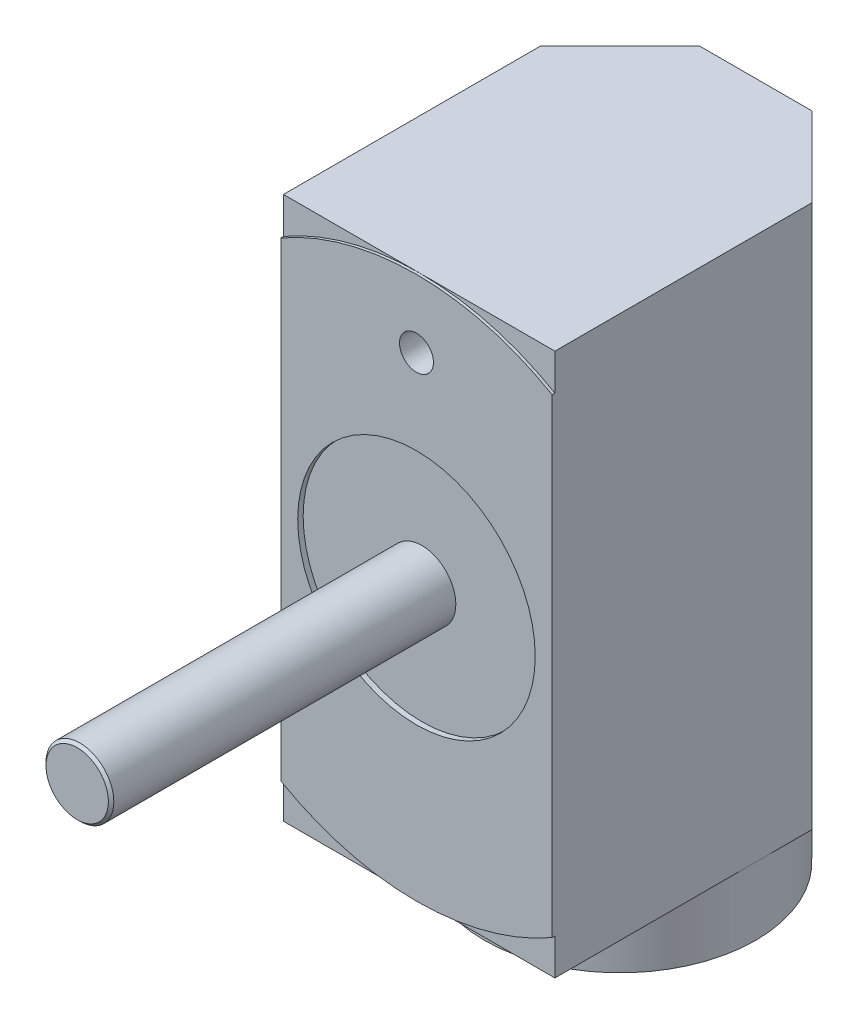
ISO-10303-21;
HEADER;
FILE_DESCRIPTION(('STEP AP214'),'2;1');
FILE_NAME('part.step','',(''),(''),'','','');
FILE_SCHEMA(('AUTOMOTIVE_DESIGN { 1 0 10303 214 1 1 1 1 }'));
ENDSEC;
DATA;
#1=APPLICATION_CONTEXT('core data for automotive mechanical design processes');
#2=APPLICATION_PROTOCOL_DEFINITION('international standard','automotive_design',2000,#1);
#3=PRODUCT_CONTEXT('',#1,'mechanical');
#4=PRODUCT('Part','Part','',(#3));
#5=PRODUCT_RELATED_PRODUCT_CATEGORY('part','',(#4));
#6=PRODUCT_DEFINITION_FORMATION('','',#4);
#7=PRODUCT_DEFINITION_CONTEXT('part definition',#1,'design');
#8=PRODUCT_DEFINITION('design','',#6,#7);
#9=PRODUCT_DEFINITION_SHAPE('','',#8);
#10=(LENGTH_UNIT() NAMED_UNIT(*) SI_UNIT(.MILLI.,.METRE.));
#11=(NAMED_UNIT(*) PLANE_ANGLE_UNIT() SI_UNIT($,.RADIAN.));
#12=(NAMED_UNIT(*) SI_UNIT($,.STERADIAN.) SOLID_ANGLE_UNIT());
#13=UNCERTAINTY_MEASURE_WITH_UNIT(LENGTH_MEASURE(1.E-05),#10,'distance_accuracy_value','');
#14=(GEOMETRIC_REPRESENTATION_CONTEXT(3) GLOBAL_UNCERTAINTY_ASSIGNED_CONTEXT((#13)) GLOBAL_UNIT_ASSIGNED_CONTEXT((#10,
#11,#12)) REPRESENTATION_CONTEXT('',''));
#15=CARTESIAN_POINT('',(0.,0.,0.));
#16=DIRECTION('',(0.,0.,1.));
#17=DIRECTION('',(1.,0.,0.));
#18=AXIS2_PLACEMENT_3D('',#15,#16,#17);
#19=CARTESIAN_POINT('',(6.34999999999999,-25.4,9.525));
#20=DIRECTION('',(0.,0.,1.));
#21=DIRECTION('',(1.,0.,0.));
#22=AXIS2_PLACEMENT_3D('',#19,#20,#21);
#23=PLANE('',#22);
#24=CARTESIAN_POINT('',(0.,-3.175,9.525));
#25=DIRECTION('',(0.,0.,1.));
#26=DIRECTION('',(1.,0.,0.));
#27=AXIS2_PLACEMENT_3D('',#24,#25,#26);
#28=CIRCLE('',#27,0.79375);
#29=CARTESIAN_POINT('',(0.79375,-3.175,9.525));
#30=VERTEX_POINT('',#29);
#31=EDGE_CURVE('E674',#30,#30,#28,.T.);
#32=ORIENTED_EDGE('',*,*,#31,.F.);
#33=EDGE_LOOP('',(#32));
#34=FACE_BOUND('',#33,.T.);
#35=CARTESIAN_POINT('',(0.,-12.7,9.525));
#36=DIRECTION('',(0.,0.,1.));
#37=DIRECTION('',(1.,0.,0.));
#38=AXIS2_PLACEMENT_3D('',#35,#36,#37);
#39=CIRCLE('',#38,5.55625);
#40=CARTESIAN_POINT('',(5.55625,-12.7,9.525));
#41=VERTEX_POINT('',#40);
#42=EDGE_CURVE('E309',#41,#41,#39,.T.);
#43=ORIENTED_EDGE('',*,*,#42,.F.);
#44=EDGE_LOOP('',(#43));
#45=FACE_BOUND('',#44,.T.);
#46=DIRECTION('',(0.,1.,0.));
#47=VECTOR('',#46,1.);
#48=CARTESIAN_POINT('',(6.34999999999999,-25.4,9.525));
#49=LINE('',#48,#47);
#50=CARTESIAN_POINT('',(6.34999999999999,-23.6985226280624,9.525));
#51=VERTEX_POINT('',#50);
#52=CARTESIAN_POINT('',(6.34999999999999,-1.70147737193763,9.525));
#53=VERTEX_POINT('',#52);
#54=EDGE_CURVE('E194',#51,#53,#49,.T.);
#55=ORIENTED_EDGE('',*,*,#54,.T.);
#56=CARTESIAN_POINT('',(0.,-12.7,9.525));
#57=DIRECTION('',(0.,0.,1.));
#58=DIRECTION('',(1.,0.,0.));
#59=AXIS2_PLACEMENT_3D('',#56,#57,#58);
#60=CIRCLE('',#59,12.7);
#61=CARTESIAN_POINT('',(-6.34999999999999,-1.70147737193763,9.525));
#62=VERTEX_POINT('',#61);
#63=EDGE_CURVE('E176',#53,#62,#60,.T.);
#64=ORIENTED_EDGE('',*,*,#63,.T.);
#65=DIRECTION('',(0.,1.,0.));
#66=VECTOR('',#65,1.);
#67=CARTESIAN_POINT('',(-6.34999999999999,-25.4,9.525));
#68=LINE('',#67,#66);
#69=CARTESIAN_POINT('',(-6.34999999999999,-23.6985226280624,9.525));
#70=VERTEX_POINT('',#69);
#71=EDGE_CURVE('E203',#70,#62,#68,.T.);
#72=ORIENTED_EDGE('',*,*,#71,.F.);
#73=CARTESIAN_POINT('',(0.,-12.7,9.525));
#74=DIRECTION('',(0.,0.,1.));
#75=DIRECTION('',(1.,0.,0.));
#76=AXIS2_PLACEMENT_3D('',#73,#74,#75);
#77=CIRCLE('',#76,12.7);
#78=EDGE_CURVE('E200',#70,#51,#77,.T.);
#79=ORIENTED_EDGE('',*,*,#78,.T.);
#80=EDGE_LOOP('',(#55,#64,#72,#79));
#81=FACE_BOUND('',#80,.T.);
#82=ADVANCED_FACE('F77',(#34,#45,#81),#23,.T.);
#83=CARTESIAN_POINT('',(0.,-25.4,0.));
#84=DIRECTION('',(0.,-1.,0.));
#85=DIRECTION('',(0.,0.,-1.));
#86=AXIS2_PLACEMENT_3D('',#83,#84,#85);
#87=PLANE('',#86);
#88=DIRECTION('',(0.,0.,-1.));
#89=VECTOR('',#88,1.);
#90=CARTESIAN_POINT('',(6.34999999999999,-25.4,9.525));
#91=LINE('',#90,#89);
#92=CARTESIAN_POINT('',(6.34999999999999,-25.4,9.398));
#93=VERTEX_POINT('',#92);
#94=CARTESIAN_POINT('',(6.34999999999999,-25.4,0.));
#95=VERTEX_POINT('',#94);
#96=EDGE_CURVE('E282',#93,#95,#91,.T.);
#97=ORIENTED_EDGE('',*,*,#96,.F.);
#98=DIRECTION('',(1.,0.,0.));
#99=VECTOR('',#98,1.);
#100=CARTESIAN_POINT('',(0.,-25.4,9.398));
#101=LINE('',#100,#99);
#102=CARTESIAN_POINT('',(0.,-25.4,9.398));
#103=VERTEX_POINT('',#102);
#104=EDGE_CURVE('E669',#103,#93,#101,.T.);
#105=ORIENTED_EDGE('',*,*,#104,.F.);
#106=DIRECTION('',(1.,0.,0.));
#107=VECTOR('',#106,1.);
#108=CARTESIAN_POINT('',(0.,-25.4,9.398));
#109=LINE('',#108,#107);
#110=CARTESIAN_POINT('',(-6.34999999999999,-25.4,9.398));
#111=VERTEX_POINT('',#110);
#112=EDGE_CURVE('E319',#111,#103,#109,.T.);
#113=ORIENTED_EDGE('',*,*,#112,.F.);
#114=DIRECTION('',(0.,0.,1.));
#115=VECTOR('',#114,1.);
#116=CARTESIAN_POINT('',(-6.34999999999999,-25.4,9.525));
#117=LINE('',#116,#115);
#118=CARTESIAN_POINT('',(-6.34999999999999,-25.4,0.));
#119=VERTEX_POINT('',#118);
#120=EDGE_CURVE('E286',#119,#111,#117,.T.);
#121=ORIENTED_EDGE('',*,*,#120,.F.);
#122=CARTESIAN_POINT('',(0.,-25.4,0.));
#123=DIRECTION('',(0.,-1.,0.));
#124=DIRECTION('',(0.,0.,-1.));
#125=AXIS2_PLACEMENT_3D('',#122,#123,#124);
#126=CIRCLE('',#125,6.35);
#127=EDGE_CURVE('E216',#95,#119,#126,.T.);
#128=ORIENTED_EDGE('',*,*,#127,.F.);
#129=EDGE_LOOP('',(#97,#105,#113,#121,#128));
#130=FACE_BOUND('',#129,.T.);
#131=ADVANCED_FACE('F351',(#130),#87,.T.);
#132=CARTESIAN_POINT('',(6.34999999999999,-25.4,9.525));
#133=DIRECTION('',(1.,0.,0.));
#134=DIRECTION('',(0.,0.,-1.));
#135=AXIS2_PLACEMENT_3D('',#132,#133,#134);
#136=PLANE('',#135);
#137=DIRECTION('',(0.,1.,0.));
#138=VECTOR('',#137,1.);
#139=CARTESIAN_POINT('',(6.34999999999999,0.,9.398));
#140=LINE('',#139,#138);
#141=CARTESIAN_POINT('',(6.34999999999999,-1.70147737193763,9.398));
#142=VERTEX_POINT('',#141);
#143=CARTESIAN_POINT('',(6.34999999999999,0.,9.398));
#144=VERTEX_POINT('',#143);
#145=EDGE_CURVE('E196',#142,#144,#140,.T.);
#146=ORIENTED_EDGE('',*,*,#145,.F.);
#147=DIRECTION('',(0.,0.,1.));
#148=VECTOR('',#147,1.);
#149=CARTESIAN_POINT('',(6.34999999999999,-1.70147737193763,9.398));
#150=LINE('',#149,#148);
#151=EDGE_CURVE('E179',#142,#53,#150,.T.);
#152=ORIENTED_EDGE('',*,*,#151,.T.);
#153=ORIENTED_EDGE('',*,*,#54,.F.);
#154=DIRECTION('',(0.,0.,1.));
#155=VECTOR('',#154,1.);
#156=CARTESIAN_POINT('',(6.34999999999999,-23.6985226280624,9.398));
#157=LINE('',#156,#155);
#158=CARTESIAN_POINT('',(6.34999999999999,-23.6985226280624,9.398));
#159=VERTEX_POINT('',#158);
#160=EDGE_CURVE('E671',#159,#51,#157,.T.);
#161=ORIENTED_EDGE('',*,*,#160,.F.);
#162=DIRECTION('',(0.,1.,0.));
#163=VECTOR('',#162,1.);
#164=CARTESIAN_POINT('',(6.34999999999999,0.,9.398));
#165=LINE('',#164,#163);
#166=EDGE_CURVE('E666',#93,#159,#165,.T.);
#167=ORIENTED_EDGE('',*,*,#166,.F.);
#168=ORIENTED_EDGE('',*,*,#96,.T.);
#169=CARTESIAN_POINT('',(6.34999999999999,-25.4,-2.63025612106915));
#170=VERTEX_POINT('',#169);
#171=EDGE_CURVE('E283',#95,#170,#91,.T.);
#172=ORIENTED_EDGE('',*,*,#171,.T.);
#173=DIRECTION('',(0.,1.,0.));
#174=VECTOR('',#173,1.);
#175=CARTESIAN_POINT('',(6.34999999999999,-25.4,-2.63025612106915));
#176=LINE('',#175,#174);
#177=CARTESIAN_POINT('',(6.34999999999999,0.,-2.63025612106915));
#178=VERTEX_POINT('',#177);
#179=EDGE_CURVE('E202',#170,#178,#176,.T.);
#180=ORIENTED_EDGE('',*,*,#179,.T.);
#181=DIRECTION('',(0.,0.,-1.));
#182=VECTOR('',#181,1.);
#183=CARTESIAN_POINT('',(6.34999999999999,0.,9.525));
#184=LINE('',#183,#182);
#185=EDGE_CURVE('E268',#144,#178,#184,.T.);
#186=ORIENTED_EDGE('',*,*,#185,.F.);
#187=EDGE_LOOP('',(#146,#152,#153,#161,#167,#168,#172,#180,#186));
#188=FACE_BOUND('',#187,.T.);
#189=ADVANCED_FACE('F192',(#188),#136,.T.);
#190=CARTESIAN_POINT('',(0.,0.,0.));
#191=DIRECTION('',(0.,-1.,0.));
#192=DIRECTION('',(0.,0.,-1.));
#193=AXIS2_PLACEMENT_3D('',#190,#191,#192);
#194=PLANE('',#193);
#195=DIRECTION('',(-1.,0.,0.));
#196=VECTOR('',#195,1.);
#197=CARTESIAN_POINT('',(0.,0.,9.398));
#198=LINE('',#197,#196);
#199=CARTESIAN_POINT('',(0.,0.,9.398));
#200=VERTEX_POINT('',#199);
#201=EDGE_CURVE('E197',#144,#200,#198,.T.);
#202=ORIENTED_EDGE('',*,*,#201,.F.);
#203=ORIENTED_EDGE('',*,*,#185,.T.);
#204=DIRECTION('',(-0.707106781186546,0.,-0.707106781186549));
#205=VECTOR('',#204,1.);
#206=CARTESIAN_POINT('',(6.34999999999999,0.,-2.63025612106915));
#207=LINE('',#206,#205);
#208=CARTESIAN_POINT('',(2.63025612106916,0.,-6.35));
#209=VERTEX_POINT('',#208);
#210=EDGE_CURVE('E254',#178,#209,#207,.T.);
#211=ORIENTED_EDGE('',*,*,#210,.T.);
#212=DIRECTION('',(-1.,0.,0.));
#213=VECTOR('',#212,1.);
#214=CARTESIAN_POINT('',(-2.63025612106916,0.,-6.35));
#215=LINE('',#214,#213);
#216=CARTESIAN_POINT('',(-2.63025612106916,0.,-6.35));
#217=VERTEX_POINT('',#216);
#218=EDGE_CURVE('E261',#209,#217,#215,.T.);
#219=ORIENTED_EDGE('',*,*,#218,.T.);
#220=DIRECTION('',(-0.707106781186546,0.,0.707106781186549));
#221=VECTOR('',#220,1.);
#222=CARTESIAN_POINT('',(-6.34999999999999,0.,-2.63025612106915));
#223=LINE('',#222,#221);
#224=CARTESIAN_POINT('',(-6.34999999999999,0.,-2.63025612106915));
#225=VERTEX_POINT('',#224);
#226=EDGE_CURVE('E245',#217,#225,#223,.T.);
#227=ORIENTED_EDGE('',*,*,#226,.T.);
#228=DIRECTION('',(0.,0.,1.));
#229=VECTOR('',#228,1.);
#230=CARTESIAN_POINT('',(-6.34999999999999,0.,9.525));
#231=LINE('',#230,#229);
#232=CARTESIAN_POINT('',(-6.34999999999999,0.,9.398));
#233=VERTEX_POINT('',#232);
#234=EDGE_CURVE('E231',#225,#233,#231,.T.);
#235=ORIENTED_EDGE('',*,*,#234,.T.);
#236=DIRECTION('',(-1.,0.,0.));
#237=VECTOR('',#236,1.);
#238=CARTESIAN_POINT('',(0.,0.,9.398));
#239=LINE('',#238,#237);
#240=EDGE_CURVE('E307',#200,#233,#239,.T.);
#241=ORIENTED_EDGE('',*,*,#240,.F.);
#242=EDGE_LOOP('',(#202,#203,#211,#219,#227,#235,#241));
#243=FACE_BOUND('',#242,.T.);
#244=ADVANCED_FACE('F267',(#243),#194,.F.);
#245=CARTESIAN_POINT('',(-6.34999999999999,-25.4,9.525));
#246=DIRECTION('',(-1.,0.,0.));
#247=DIRECTION('',(0.,0.,1.));
#248=AXIS2_PLACEMENT_3D('',#245,#246,#247);
#249=PLANE('',#248);
#250=ORIENTED_EDGE('',*,*,#71,.T.);
#251=DIRECTION('',(0.,0.,1.));
#252=VECTOR('',#251,1.);
#253=CARTESIAN_POINT('',(-6.34999999999999,-1.70147737193763,9.398));
#254=LINE('',#253,#252);
#255=CARTESIAN_POINT('',(-6.34999999999999,-1.70147737193763,9.398));
#256=VERTEX_POINT('',#255);
#257=EDGE_CURVE('E181',#256,#62,#254,.T.);
#258=ORIENTED_EDGE('',*,*,#257,.F.);
#259=DIRECTION('',(0.,-1.,0.));
#260=VECTOR('',#259,1.);
#261=CARTESIAN_POINT('',(-6.34999999999999,0.,9.398));
#262=LINE('',#261,#260);
#263=EDGE_CURVE('E304',#233,#256,#262,.T.);
#264=ORIENTED_EDGE('',*,*,#263,.F.);
#265=ORIENTED_EDGE('',*,*,#234,.F.);
#266=DIRECTION('',(0.,1.,0.));
#267=VECTOR('',#266,1.);
#268=CARTESIAN_POINT('',(-6.34999999999999,-25.4,-2.63025612106915));
#269=LINE('',#268,#267);
#270=CARTESIAN_POINT('',(-6.34999999999999,-25.4,-2.63025612106915));
#271=VERTEX_POINT('',#270);
#272=EDGE_CURVE('E235',#271,#225,#269,.T.);
#273=ORIENTED_EDGE('',*,*,#272,.F.);
#274=EDGE_CURVE('E284',#271,#119,#117,.T.);
#275=ORIENTED_EDGE('',*,*,#274,.T.);
#276=ORIENTED_EDGE('',*,*,#120,.T.);
#277=DIRECTION('',(0.,-1.,0.));
#278=VECTOR('',#277,1.);
#279=CARTESIAN_POINT('',(-6.34999999999999,0.,9.398));
#280=LINE('',#279,#278);
#281=CARTESIAN_POINT('',(-6.34999999999999,-23.6985226280624,9.398));
#282=VERTEX_POINT('',#281);
#283=EDGE_CURVE('E317',#282,#111,#280,.T.);
#284=ORIENTED_EDGE('',*,*,#283,.F.);
#285=DIRECTION('',(0.,0.,1.));
#286=VECTOR('',#285,1.);
#287=CARTESIAN_POINT('',(-6.34999999999999,-23.6985226280624,9.398));
#288=LINE('',#287,#286);
#289=EDGE_CURVE('E187',#282,#70,#288,.T.);
#290=ORIENTED_EDGE('',*,*,#289,.T.);
#291=EDGE_LOOP('',(#250,#258,#264,#265,#273,#275,#276,#284,#290));
#292=FACE_BOUND('',#291,.T.);
#293=ADVANCED_FACE('F301',(#292),#249,.T.);
#294=CARTESIAN_POINT('',(0.,-25.4,-6.35));
#295=VERTEX_POINT('',#294);
#296=CARTESIAN_POINT('',(4.49012806053459,-25.4,-4.49012806053457));
#297=VERTEX_POINT('',#296);
#298=EDGE_CURVE('E218',#295,#297,#126,.T.);
#299=ORIENTED_EDGE('',*,*,#298,.F.);
#300=DIRECTION('',(-1.,0.,0.));
#301=VECTOR('',#300,1.);
#302=CARTESIAN_POINT('',(-2.63025612106916,-25.4,-6.35));
#303=LINE('',#302,#301);
#304=CARTESIAN_POINT('',(2.63025612106916,-25.4,-6.35));
#305=VERTEX_POINT('',#304);
#306=EDGE_CURVE('E277',#305,#295,#303,.T.);
#307=ORIENTED_EDGE('',*,*,#306,.F.);
#308=DIRECTION('',(-0.707106781186546,0.,-0.707106781186549));
#309=VECTOR('',#308,1.);
#310=CARTESIAN_POINT('',(6.34999999999999,-25.4,-2.63025612106915));
#311=LINE('',#310,#309);
#312=EDGE_CURVE('E257',#297,#305,#311,.T.);
#313=ORIENTED_EDGE('',*,*,#312,.F.);
#314=EDGE_LOOP('',(#299,#307,#313));
#315=FACE_BOUND('',#314,.T.);
#316=ADVANCED_FACE('F359',(#315),#87,.T.);
#317=EDGE_CURVE('E212',#297,#95,#126,.T.);
#318=ORIENTED_EDGE('',*,*,#317,.F.);
#319=EDGE_CURVE('E280',#170,#297,#311,.T.);
#320=ORIENTED_EDGE('',*,*,#319,.F.);
#321=ORIENTED_EDGE('',*,*,#171,.F.);
#322=EDGE_LOOP('',(#318,#320,#321));
#323=FACE_BOUND('',#322,.T.);
#324=ADVANCED_FACE('F369',(#323),#87,.T.);
#325=CARTESIAN_POINT('',(-4.49012806053459,-25.4,-4.49012806053457));
#326=VERTEX_POINT('',#325);
#327=EDGE_CURVE('E222',#119,#326,#126,.T.);
#328=ORIENTED_EDGE('',*,*,#327,.F.);
#329=ORIENTED_EDGE('',*,*,#274,.F.);
#330=DIRECTION('',(-0.707106781186546,0.,0.707106781186549));
#331=VECTOR('',#330,1.);
#332=CARTESIAN_POINT('',(-6.34999999999999,-25.4,-2.63025612106915));
#333=LINE('',#332,#331);
#334=EDGE_CURVE('E276',#326,#271,#333,.T.);
#335=ORIENTED_EDGE('',*,*,#334,.F.);
#336=EDGE_LOOP('',(#328,#329,#335));
#337=FACE_BOUND('',#336,.T.);
#338=ADVANCED_FACE('F300',(#337),#87,.T.);
#339=CARTESIAN_POINT('',(-6.34999999999999,-25.4,-2.63025612106915));
#340=DIRECTION('',(-0.707106781186549,0.,-0.707106781186546));
#341=DIRECTION('',(-0.707106781186546,0.,0.707106781186549));
#342=AXIS2_PLACEMENT_3D('',#339,#340,#341);
#343=PLANE('',#342);
#344=ORIENTED_EDGE('',*,*,#226,.F.);
#345=DIRECTION('',(0.,1.,0.));
#346=VECTOR('',#345,1.);
#347=CARTESIAN_POINT('',(-2.63025612106916,-25.4,-6.35));
#348=LINE('',#347,#346);
#349=CARTESIAN_POINT('',(-2.63025612106916,-25.4,-6.35));
#350=VERTEX_POINT('',#349);
#351=EDGE_CURVE('E237',#350,#217,#348,.T.);
#352=ORIENTED_EDGE('',*,*,#351,.F.);
#353=EDGE_CURVE('E208',#350,#326,#333,.T.);
#354=ORIENTED_EDGE('',*,*,#353,.T.);
#355=ORIENTED_EDGE('',*,*,#334,.T.);
#356=ORIENTED_EDGE('',*,*,#272,.T.);
#357=EDGE_LOOP('',(#344,#352,#354,#355,#356));
#358=FACE_BOUND('',#357,.T.);
#359=ADVANCED_FACE('F293',(#358),#343,.T.);
#360=CARTESIAN_POINT('',(-2.63025612106916,-25.4,-6.35));
#361=DIRECTION('',(0.,0.,-1.));
#362=DIRECTION('',(-1.,0.,0.));
#363=AXIS2_PLACEMENT_3D('',#360,#361,#362);
#364=PLANE('',#363);
#365=ORIENTED_EDGE('',*,*,#218,.F.);
#366=DIRECTION('',(0.,1.,0.));
#367=VECTOR('',#366,1.);
#368=CARTESIAN_POINT('',(2.63025612106916,-25.4,-6.35));
#369=LINE('',#368,#367);
#370=EDGE_CURVE('E206',#305,#209,#369,.T.);
#371=ORIENTED_EDGE('',*,*,#370,.F.);
#372=ORIENTED_EDGE('',*,*,#306,.T.);
#373=EDGE_CURVE('E279',#295,#350,#303,.T.);
#374=ORIENTED_EDGE('',*,*,#373,.T.);
#375=ORIENTED_EDGE('',*,*,#351,.T.);
#376=EDGE_LOOP('',(#365,#371,#372,#374,#375));
#377=FACE_BOUND('',#376,.T.);
#378=ADVANCED_FACE('F262',(#377),#364,.T.);
#379=CARTESIAN_POINT('',(6.34999999999999,-25.4,-2.63025612106915));
#380=DIRECTION('',(0.707106781186549,0.,-0.707106781186546));
#381=DIRECTION('',(-0.707106781186546,0.,-0.707106781186549));
#382=AXIS2_PLACEMENT_3D('',#379,#380,#381);
#383=PLANE('',#382);
#384=ORIENTED_EDGE('',*,*,#210,.F.);
#385=ORIENTED_EDGE('',*,*,#179,.F.);
#386=ORIENTED_EDGE('',*,*,#319,.T.);
#387=ORIENTED_EDGE('',*,*,#312,.T.);
#388=ORIENTED_EDGE('',*,*,#370,.T.);
#389=EDGE_LOOP('',(#384,#385,#386,#387,#388));
#390=FACE_BOUND('',#389,.T.);
#391=ADVANCED_FACE('F251',(#390),#383,.T.);
#392=EDGE_CURVE('E227',#326,#295,#126,.T.);
#393=ORIENTED_EDGE('',*,*,#392,.F.);
#394=ORIENTED_EDGE('',*,*,#353,.F.);
#395=ORIENTED_EDGE('',*,*,#373,.F.);
#396=EDGE_LOOP('',(#393,#394,#395));
#397=FACE_BOUND('',#396,.T.);
#398=ADVANCED_FACE('F297',(#397),#87,.T.);
#399=CARTESIAN_POINT('',(0.,-28.575,0.));
#400=DIRECTION('',(0.,1.,0.));
#401=DIRECTION('',(0.,0.,1.));
#402=AXIS2_PLACEMENT_3D('',#399,#400,#401);
#403=CYLINDRICAL_SURFACE('',#402,6.35);
#404=CARTESIAN_POINT('',(0.,-28.575,0.));
#405=DIRECTION('',(0.,-1.,0.));
#406=DIRECTION('',(0.,0.,-1.));
#407=AXIS2_PLACEMENT_3D('',#404,#405,#406);
#408=CIRCLE('',#407,6.35);
#409=CARTESIAN_POINT('',(0.,-28.575,-6.35));
#410=VERTEX_POINT('',#409);
#411=EDGE_CURVE('E225',#410,#410,#408,.T.);
#412=ORIENTED_EDGE('',*,*,#411,.F.);
#413=EDGE_LOOP('',(#412));
#414=FACE_BOUND('',#413,.T.);
#415=ORIENTED_EDGE('',*,*,#298,.T.);
#416=ORIENTED_EDGE('',*,*,#317,.T.);
#417=ORIENTED_EDGE('',*,*,#127,.T.);
#418=ORIENTED_EDGE('',*,*,#327,.T.);
#419=ORIENTED_EDGE('',*,*,#392,.T.);
#420=EDGE_LOOP('',(#415,#416,#417,#418,#419));
#421=FACE_BOUND('',#420,.T.);
#422=ADVANCED_FACE('F341',(#414,#421),#403,.T.);
#423=CARTESIAN_POINT('',(0.,-28.575,0.));
#424=DIRECTION('',(0.,-1.,0.));
#425=DIRECTION('',(0.,0.,-1.));
#426=AXIS2_PLACEMENT_3D('',#423,#424,#425);
#427=PLANE('',#426);
#428=CARTESIAN_POINT('',(0.,-28.575,0.));
#429=DIRECTION('',(0.,-1.,0.));
#430=DIRECTION('',(0.,0.,-1.));
#431=AXIS2_PLACEMENT_3D('',#428,#429,#430);
#432=CIRCLE('',#431,4.7625);
#433=CARTESIAN_POINT('',(0.,-28.575,-4.7625));
#434=VERTEX_POINT('',#433);
#435=EDGE_CURVE('E233',#434,#434,#432,.T.);
#436=ORIENTED_EDGE('',*,*,#435,.F.);
#437=EDGE_LOOP('',(#436));
#438=FACE_BOUND('',#437,.T.);
#439=ORIENTED_EDGE('',*,*,#411,.T.);
#440=EDGE_LOOP('',(#439));
#441=FACE_BOUND('',#440,.T.);
#442=ADVANCED_FACE('F338',(#438,#441),#427,.T.);
#443=CARTESIAN_POINT('',(0.,-2.38125,0.));
#444=DIRECTION('',(0.,-1.,0.));
#445=DIRECTION('',(0.,0.,-1.));
#446=AXIS2_PLACEMENT_3D('',#443,#444,#445);
#447=CYLINDRICAL_SURFACE('',#446,4.7625);
#448=CARTESIAN_POINT('',(0.,-2.38125,0.));
#449=DIRECTION('',(0.,-1.,0.));
#450=DIRECTION('',(0.,0.,-1.));
#451=AXIS2_PLACEMENT_3D('',#448,#449,#450);
#452=CIRCLE('',#451,4.7625);
#453=CARTESIAN_POINT('',(0.,-2.38125,4.7625));
#454=VERTEX_POINT('',#453);
#455=EDGE_CURVE('E226',#454,#454,#452,.T.);
#456=ORIENTED_EDGE('',*,*,#455,.F.);
#457=CARTESIAN_POINT('',(0.,-2.38125,4.7625));
#458=CARTESIAN_POINT('',(-0.0442566123242332,-2.38125177449093,4.76249924171101));
#459=CARTESIAN_POINT('',(-0.0885373774838256,-2.38496388480263,4.76187667737388));
#460=CARTESIAN_POINT('',(-0.175856970381191,-2.39970807165799,4.7594530951889));
#461=CARTESIAN_POINT('',(-0.218894618077061,-2.41074687931944,4.75765099370835));
#462=CARTESIAN_POINT('',(-0.302452007240014,-2.4398019049282,4.75307046665073));
#463=CARTESIAN_POINT('',(-0.342973776977128,-2.45781241534088,4.75029283988044));
#464=CARTESIAN_POINT('',(-0.420415034827997,-2.50028465272664,4.74406667098557));
#465=CARTESIAN_POINT('',(-0.457334934286452,-2.52474564185085,4.74061820560783));
#466=CARTESIAN_POINT('',(-0.526882555037608,-2.579673239113,4.73339578293014));
#467=CARTESIAN_POINT('',(-0.559470846872352,-2.61018944389697,4.72961929301217));
#468=CARTESIAN_POINT('',(-0.619089598324527,-2.67625447999012,4.72218584033363));
#469=CARTESIAN_POINT('',(-0.646119707056633,-2.71180362878748,4.71852888513147));
#470=CARTESIAN_POINT('',(-0.69401281237963,-2.78719628176757,4.7117240212873));
#471=CARTESIAN_POINT('',(-0.714836820533368,-2.82706487443551,4.70857938486594));
#472=CARTESIAN_POINT('',(-0.749477281018062,-2.90979528666545,4.70319033259809));
#473=CARTESIAN_POINT('',(-0.763294206697082,-2.95265690381765,4.70094585594543));
#474=CARTESIAN_POINT('',(-0.783404064946676,-3.03973873726695,4.69763645447575));
#475=CARTESIAN_POINT('',(-0.78976506675049,-3.08394282133919,4.6965608649421));
#476=CARTESIAN_POINT('',(-0.794993560279535,-3.1728029879105,4.69567875612386));
#477=CARTESIAN_POINT('',(-0.793861582323506,-3.21745903819812,4.69587214702666));
#478=CARTESIAN_POINT('',(-0.784191693740778,-3.30546959595496,4.69749641164179));
#479=CARTESIAN_POINT('',(-0.775730250000003,-3.34883277512561,4.69891450778756));
#480=CARTESIAN_POINT('',(-0.751761622078093,-3.43351526841075,4.70280839729495));
#481=CARTESIAN_POINT('',(-0.736254196246518,-3.47483451237211,4.70528422693264));
#482=CARTESIAN_POINT('',(-0.698556275634817,-3.55448515144249,4.71102842188577));
#483=CARTESIAN_POINT('',(-0.676334027656809,-3.59280123643079,4.71430053806576));
#484=CARTESIAN_POINT('',(-0.625859815574485,-3.66518964717094,4.72126601596765));
#485=CARTESIAN_POINT('',(-0.597607364807736,-3.69926163005444,4.72495941167736));
#486=CARTESIAN_POINT('',(-0.5354581023605,-3.76263728224383,4.73240743851832));
#487=CARTESIAN_POINT('',(-0.501495683529718,-3.79187662963648,4.73616226131049));
#488=CARTESIAN_POINT('',(-0.429112441551672,-3.84425118964625,4.7432677594346));
#489=CARTESIAN_POINT('',(-0.390691589680289,-3.86738636293318,4.74661843216244));
#490=CARTESIAN_POINT('',(-0.310421628382931,-3.90690170711577,4.752542859935));
#491=CARTESIAN_POINT('',(-0.26856967036678,-3.92327619563768,4.75511596094364));
#492=CARTESIAN_POINT('',(-0.182657224728867,-3.9487456633406,4.75919007206519));
#493=CARTESIAN_POINT('',(-0.138596922189481,-3.95784125148916,4.76069117186275));
#494=CARTESIAN_POINT('',(-0.0500728936632654,-3.96840753131141,4.76244008725053));
#495=CARTESIAN_POINT('',(-0.00561998404544604,-3.96996652404828,4.76270241581559));
#496=CARTESIAN_POINT('',(0.0829118778925392,-3.96565077314407,4.76198398128722));
#497=CARTESIAN_POINT('',(0.126990844535722,-3.95977631553004,4.76100326602408));
#498=CARTESIAN_POINT('',(0.213250835736097,-3.94083386033599,4.75791792552879));
#499=CARTESIAN_POINT('',(0.255441725712358,-3.92780957883614,4.75582013274416));
#500=CARTESIAN_POINT('',(0.337041135943191,-3.89498379047165,4.75073492464576));
#501=CARTESIAN_POINT('',(0.376449499801336,-3.8751819030258,4.74774745937566));
#502=CARTESIAN_POINT('',(0.451748743906394,-3.82916076790877,4.74117833926014));
#503=CARTESIAN_POINT('',(0.487605467172544,-3.8028863629169,4.7375916674413));
#504=CARTESIAN_POINT('',(0.554432338397103,-3.74474190236525,4.73023713396929));
#505=CARTESIAN_POINT('',(0.585402131103664,-3.71287144035966,4.72646925916966));
#506=CARTESIAN_POINT('',(0.641903332541415,-3.64404352848732,4.71913005637381));
#507=CARTESIAN_POINT('',(0.667375081653604,-3.60703680244918,4.71556116873531));
#508=CARTESIAN_POINT('',(0.711740483518658,-3.52921793229852,4.70906960704478));
#509=CARTESIAN_POINT('',(0.730634344789418,-3.48840590886527,4.70614691250961));
#510=CARTESIAN_POINT('',(0.761218420242725,-3.40430175983215,4.70129696549021));
#511=CARTESIAN_POINT('',(0.772938329833972,-3.36102067982782,4.69936561493763));
#512=CARTESIAN_POINT('',(0.788935256574603,-3.27306935897209,4.69670675095195));
#513=CARTESIAN_POINT('',(0.793212920792908,-3.22839923923508,4.69597913286014));
#514=CARTESIAN_POINT('',(0.794185884970034,-3.13953360980694,4.69581462754174));
#515=CARTESIAN_POINT('',(0.790975093219747,-3.09533912980235,4.69636175440544));
#516=CARTESIAN_POINT('',(0.777265348868799,-3.00812858874388,4.69865005611559));
#517=CARTESIAN_POINT('',(0.766766419890711,-2.96511252387096,4.70039122709185));
#518=CARTESIAN_POINT('',(0.738814400446381,-2.8815161961596,4.70486535619446));
#519=CARTESIAN_POINT('',(0.72136939501564,-2.84093316430721,4.70759716092245));
#520=CARTESIAN_POINT('',(0.680030073743301,-2.76325467503064,4.71374587132801));
#521=CARTESIAN_POINT('',(0.656135438027669,-2.72615939070685,4.71716281098317));
#522=CARTESIAN_POINT('',(0.60223999578816,-2.65603495236329,4.72434746659485));
#523=CARTESIAN_POINT('',(0.572170103940983,-2.62305926469766,4.72811886345476));
#524=CARTESIAN_POINT('',(0.506923367463223,-2.56258961557921,4.73555813224567));
#525=CARTESIAN_POINT('',(0.471745345849762,-2.53509692095738,4.73922598008428));
#526=CARTESIAN_POINT('',(0.396992211360789,-2.48620017484652,4.74607423161405));
#527=CARTESIAN_POINT('',(0.35738841004167,-2.46483948251814,4.74925109410361));
#528=CARTESIAN_POINT('',(0.275117899527826,-2.42910693863635,4.75472495713564));
#529=CARTESIAN_POINT('',(0.232454289608528,-2.4147281267572,4.7570228334635));
#530=CARTESIAN_POINT('',(0.158020800939415,-2.39648832546479,4.75997838589463));
#531=CARTESIAN_POINT('',(0.126701178619757,-2.39078310589693,4.76091893659291));
#532=CARTESIAN_POINT('',(0.0635918560265394,-2.38316333823429,4.76218001075593));
#533=CARTESIAN_POINT('',(0.0318021638556969,-2.38124872487639,4.76250054489554));
#534=CARTESIAN_POINT('',(0.,-2.38125,4.7625));
#535=B_SPLINE_CURVE_WITH_KNOTS('',3,(#457,#458,#459,#460,#461,#462,#463,#464,#465,#466,#467,
#468,#469,#470,#471,#472,#473,#474,#475,#476,#477,#478,#479,#480,#481,#482,#483,#484,#485,#486,
#487,#488,#489,#490,#491,#492,#493,#494,#495,#496,#497,#498,#499,#500,#501,#502,#503,#504,#505,
#506,#507,#508,#509,#510,#511,#512,#513,#514,#515,#516,#517,#518,#519,#520,#521,#522,#523,#524,
#525,#526,#527,#528,#529,#530,#531,#532,#533,#534),.UNSPECIFIED.,.T.,.F.,(4,2,2,2,2,2,2,2,2,2,2,
2,2,2,2,2,2,2,2,2,2,2,2,2,2,2,2,2,2,2,2,2,2,2,2,2,2,2,4),(0.,0.132653590717977,
0.265429220758296,0.398096380280523,0.530748371024246,0.664535409122904,0.798330890539295,
0.932950003615692,1.06756002158187,1.20093129480337,1.33429312871881,1.4662801565893,
1.59827171145558,1.73089746730837,1.86353393066082,1.99781404446846,2.13209502344382,
2.26648863730799,2.40087100635465,2.53367503008519,2.66647394388885,2.79846978724537,
2.93047304374776,3.0636426713658,3.19682197519735,3.33138088487419,3.46593552866862,
3.59992937093513,3.73391156247251,3.86622261273457,3.99853323414732,4.13069029786826,
4.26285391721814,4.39658564481402,4.53034823506574,4.66503458535286,4.79958638801298,
4.89491098792076,4.99023394660437),.UNSPECIFIED.);
#536=EDGE_CURVE('E91',#454,#454,#535,.T.);
#537=ORIENTED_EDGE('',*,*,#536,.T.);
#538=EDGE_LOOP('',(#456,#537));
#539=FACE_BOUND('',#538,.T.);
#540=ORIENTED_EDGE('',*,*,#435,.T.);
#541=EDGE_LOOP('',(#540));
#542=FACE_BOUND('',#541,.T.);
#543=ADVANCED_FACE('F336',(#539,#542),#447,.F.);
#544=CARTESIAN_POINT('',(0.,-2.38125,0.));
#545=DIRECTION('',(0.,-1.,0.));
#546=DIRECTION('',(0.,0.,-1.));
#547=AXIS2_PLACEMENT_3D('',#544,#545,#546);
#548=PLANE('',#547);
#549=ORIENTED_EDGE('',*,*,#455,.T.);
#550=EDGE_LOOP('',(#549));
#551=FACE_BOUND('',#550,.T.);
#552=ADVANCED_FACE('F416',(#551),#548,.T.);
#553=CARTESIAN_POINT('',(0.,-12.7,9.271));
#554=DIRECTION('',(0.,0.,1.));
#555=DIRECTION('',(1.,0.,0.));
#556=AXIS2_PLACEMENT_3D('',#553,#554,#555);
#557=CYLINDRICAL_SURFACE('',#556,5.55625);
#558=CARTESIAN_POINT('',(0.,-12.7,9.271));
#559=DIRECTION('',(0.,0.,1.));
#560=DIRECTION('',(1.,0.,0.));
#561=AXIS2_PLACEMENT_3D('',#558,#559,#560);
#562=CIRCLE('',#561,5.55625);
#563=CARTESIAN_POINT('',(5.55625,-12.7,9.271));
#564=VERTEX_POINT('',#563);
#565=EDGE_CURVE('E328',#564,#564,#562,.T.);
#566=ORIENTED_EDGE('',*,*,#565,.F.);
#567=EDGE_LOOP('',(#566));
#568=FACE_BOUND('',#567,.T.);
#569=ORIENTED_EDGE('',*,*,#42,.T.);
#570=EDGE_LOOP('',(#569));
#571=FACE_BOUND('',#570,.T.);
#572=ADVANCED_FACE('F410',(#568,#571),#557,.F.);
#573=CARTESIAN_POINT('',(0.,0.,9.271));
#574=DIRECTION('',(0.,0.,1.));
#575=DIRECTION('',(1.,0.,0.));
#576=AXIS2_PLACEMENT_3D('',#573,#574,#575);
#577=PLANE('',#576);
#578=CARTESIAN_POINT('',(0.,-12.7,9.271));
#579=DIRECTION('',(0.,0.,1.));
#580=DIRECTION('',(1.,0.,0.));
#581=AXIS2_PLACEMENT_3D('',#578,#579,#580);
#582=CIRCLE('',#581,1.5875);
#583=CARTESIAN_POINT('',(1.5875,-12.7,9.271));
#584=VERTEX_POINT('',#583);
#585=EDGE_CURVE('E325',#584,#584,#582,.F.);
#586=ORIENTED_EDGE('',*,*,#585,.T.);
#587=EDGE_LOOP('',(#586));
#588=FACE_BOUND('',#587,.T.);
#589=ORIENTED_EDGE('',*,*,#565,.T.);
#590=EDGE_LOOP('',(#589));
#591=FACE_BOUND('',#590,.T.);
#592=ADVANCED_FACE('F415',(#588,#591),#577,.T.);
#593=CARTESIAN_POINT('',(0.,0.,25.4));
#594=DIRECTION('',(0.,0.,1.));
#595=DIRECTION('',(1.,0.,0.));
#596=AXIS2_PLACEMENT_3D('',#593,#594,#595);
#597=PLANE('',#596);
#598=CARTESIAN_POINT('',(0.,-12.7,25.4));
#599=DIRECTION('',(0.,0.,1.));
#600=DIRECTION('',(1.,0.,0.));
#601=AXIS2_PLACEMENT_3D('',#598,#599,#600);
#602=CIRCLE('',#601,1.4605);
#603=CARTESIAN_POINT('',(1.4605,-12.7,25.4));
#604=VERTEX_POINT('',#603);
#605=EDGE_CURVE('E86',#604,#604,#602,.T.);
#606=ORIENTED_EDGE('',*,*,#605,.T.);
#607=EDGE_LOOP('',(#606));
#608=FACE_BOUND('',#607,.T.);
#609=ADVANCED_FACE('F429',(#608),#597,.T.);
#610=CARTESIAN_POINT('',(0.,-12.7,25.4));
#611=DIRECTION('',(0.,0.,-1.));
#612=DIRECTION('',(-1.,0.,0.));
#613=AXIS2_PLACEMENT_3D('',#610,#611,#612);
#614=CYLINDRICAL_SURFACE('',#613,1.5875);
#615=CARTESIAN_POINT('',(0.,-12.7,25.273));
#616=DIRECTION('',(0.,0.,1.));
#617=DIRECTION('',(1.,0.,0.));
#618=AXIS2_PLACEMENT_3D('',#615,#616,#617);
#619=CIRCLE('',#618,1.5875);
#620=CARTESIAN_POINT('',(1.5875,-12.7,25.273));
#621=VERTEX_POINT('',#620);
#622=EDGE_CURVE('E12',#621,#621,#619,.F.);
#623=ORIENTED_EDGE('',*,*,#622,.T.);
#624=EDGE_LOOP('',(#623));
#625=FACE_BOUND('',#624,.T.);
#626=ORIENTED_EDGE('',*,*,#585,.F.);
#627=EDGE_LOOP('',(#626));
#628=FACE_BOUND('',#627,.T.);
#629=ADVANCED_FACE('F466',(#625,#628),#614,.T.);
#630=CARTESIAN_POINT('',(0.,-12.7,9.398));
#631=DIRECTION('',(0.,0.,1.));
#632=DIRECTION('',(1.,0.,0.));
#633=AXIS2_PLACEMENT_3D('',#630,#631,#632);
#634=CYLINDRICAL_SURFACE('',#633,12.7);
#635=ORIENTED_EDGE('',*,*,#63,.F.);
#636=ORIENTED_EDGE('',*,*,#151,.F.);
#637=CARTESIAN_POINT('',(0.,-12.7,9.398));
#638=DIRECTION('',(0.,0.,1.));
#639=DIRECTION('',(1.,0.,0.));
#640=AXIS2_PLACEMENT_3D('',#637,#638,#639);
#641=CIRCLE('',#640,12.7);
#642=EDGE_CURVE('E98',#142,#200,#641,.T.);
#643=ORIENTED_EDGE('',*,*,#642,.T.);
#644=CARTESIAN_POINT('',(0.,-12.7,9.398));
#645=DIRECTION('',(0.,0.,1.));
#646=DIRECTION('',(1.,0.,0.));
#647=AXIS2_PLACEMENT_3D('',#644,#645,#646);
#648=CIRCLE('',#647,12.7);
#649=EDGE_CURVE('E186',#200,#256,#648,.T.);
#650=ORIENTED_EDGE('',*,*,#649,.T.);
#651=ORIENTED_EDGE('',*,*,#257,.T.);
#652=EDGE_LOOP('',(#635,#636,#643,#650,#651));
#653=FACE_BOUND('',#652,.T.);
#654=ADVANCED_FACE('F178',(#653),#634,.T.);
#655=CARTESIAN_POINT('',(0.,0.,9.398));
#656=DIRECTION('',(0.,0.,1.));
#657=DIRECTION('',(1.,0.,0.));
#658=AXIS2_PLACEMENT_3D('',#655,#656,#657);
#659=PLANE('',#658);
#660=ORIENTED_EDGE('',*,*,#649,.F.);
#661=ORIENTED_EDGE('',*,*,#240,.T.);
#662=ORIENTED_EDGE('',*,*,#263,.T.);
#663=EDGE_LOOP('',(#660,#661,#662));
#664=FACE_BOUND('',#663,.T.);
#665=ADVANCED_FACE('F465',(#664),#659,.T.);
#666=CARTESIAN_POINT('',(0.,-12.7,9.398));
#667=DIRECTION('',(0.,0.,1.));
#668=DIRECTION('',(1.,0.,0.));
#669=AXIS2_PLACEMENT_3D('',#666,#667,#668);
#670=CYLINDRICAL_SURFACE('',#669,12.7);
#671=ORIENTED_EDGE('',*,*,#78,.F.);
#672=ORIENTED_EDGE('',*,*,#289,.F.);
#673=CARTESIAN_POINT('',(0.,-12.7,9.398));
#674=DIRECTION('',(0.,0.,1.));
#675=DIRECTION('',(1.,0.,0.));
#676=AXIS2_PLACEMENT_3D('',#673,#674,#675);
#677=CIRCLE('',#676,12.7);
#678=EDGE_CURVE('E314',#282,#103,#677,.T.);
#679=ORIENTED_EDGE('',*,*,#678,.T.);
#680=CARTESIAN_POINT('',(0.,-12.7,9.398));
#681=DIRECTION('',(0.,0.,1.));
#682=DIRECTION('',(1.,0.,0.));
#683=AXIS2_PLACEMENT_3D('',#680,#681,#682);
#684=CIRCLE('',#683,12.7);
#685=EDGE_CURVE('E198',#103,#159,#684,.T.);
#686=ORIENTED_EDGE('',*,*,#685,.T.);
#687=ORIENTED_EDGE('',*,*,#160,.T.);
#688=EDGE_LOOP('',(#671,#672,#679,#686,#687));
#689=FACE_BOUND('',#688,.T.);
#690=ADVANCED_FACE('F468',(#689),#670,.T.);
#691=CARTESIAN_POINT('',(0.,0.,9.398));
#692=DIRECTION('',(0.,0.,1.));
#693=DIRECTION('',(1.,0.,0.));
#694=AXIS2_PLACEMENT_3D('',#691,#692,#693);
#695=PLANE('',#694);
#696=ORIENTED_EDGE('',*,*,#678,.F.);
#697=ORIENTED_EDGE('',*,*,#283,.T.);
#698=ORIENTED_EDGE('',*,*,#112,.T.);
#699=EDGE_LOOP('',(#696,#697,#698));
#700=FACE_BOUND('',#699,.T.);
#701=ADVANCED_FACE('F488',(#700),#695,.T.);
#702=CARTESIAN_POINT('',(0.,0.,9.398));
#703=DIRECTION('',(0.,0.,1.));
#704=DIRECTION('',(1.,0.,0.));
#705=AXIS2_PLACEMENT_3D('',#702,#703,#704);
#706=PLANE('',#705);
#707=ORIENTED_EDGE('',*,*,#685,.F.);
#708=ORIENTED_EDGE('',*,*,#104,.T.);
#709=ORIENTED_EDGE('',*,*,#166,.T.);
#710=EDGE_LOOP('',(#707,#708,#709));
#711=FACE_BOUND('',#710,.T.);
#712=ADVANCED_FACE('F498',(#711),#706,.T.);
#713=CARTESIAN_POINT('',(0.,0.,9.398));
#714=DIRECTION('',(0.,0.,1.));
#715=DIRECTION('',(1.,0.,0.));
#716=AXIS2_PLACEMENT_3D('',#713,#714,#715);
#717=PLANE('',#716);
#718=ORIENTED_EDGE('',*,*,#642,.F.);
#719=ORIENTED_EDGE('',*,*,#145,.T.);
#720=ORIENTED_EDGE('',*,*,#201,.T.);
#721=EDGE_LOOP('',(#718,#719,#720));
#722=FACE_BOUND('',#721,.T.);
#723=ADVANCED_FACE('F509',(#722),#717,.T.);
#724=CARTESIAN_POINT('',(0.,-3.175,3.937));
#725=DIRECTION('',(0.,0.,1.));
#726=DIRECTION('',(1.,0.,0.));
#727=AXIS2_PLACEMENT_3D('',#724,#725,#726);
#728=CYLINDRICAL_SURFACE('',#727,0.79375);
#729=ORIENTED_EDGE('',*,*,#31,.T.);
#730=EDGE_LOOP('',(#729));
#731=FACE_BOUND('',#730,.T.);
#732=ORIENTED_EDGE('',*,*,#536,.F.);
#733=EDGE_LOOP('',(#732));
#734=FACE_BOUND('',#733,.T.);
#735=ADVANCED_FACE('F519',(#731,#734),#728,.F.);
#736=CARTESIAN_POINT('',(0.,-12.7,25.4));
#737=DIRECTION('',(0.,0.,-1.));
#738=DIRECTION('',(-1.,0.,0.));
#739=AXIS2_PLACEMENT_3D('',#736,#737,#738);
#740=CONICAL_SURFACE('',#739,1.4605,0.785398163397426);
#741=ORIENTED_EDGE('',*,*,#622,.F.);
#742=EDGE_LOOP('',(#741));
#743=FACE_BOUND('',#742,.T.);
#744=ORIENTED_EDGE('',*,*,#605,.F.);
#745=EDGE_LOOP('',(#744));
#746=FACE_BOUND('',#745,.T.);
#747=ADVANCED_FACE('F80',(#743,#746),#740,.T.);
#748=CLOSED_SHELL('',(#82,#131,#189,#244,#293,#316,#324,#338,#359,#378,#391,#398,#422,#442,#543,
#552,#572,#592,#609,#629,#654,#665,#690,#701,#712,#723,#735,#747));
#749=MANIFOLD_SOLID_BREP('B2',#748);
#750=ADVANCED_BREP_SHAPE_REPRESENTATION('',(#18,#749),#14);
#751=SHAPE_DEFINITION_REPRESENTATION(#9,#750);
ENDSEC;
END-ISO-10303-21;
